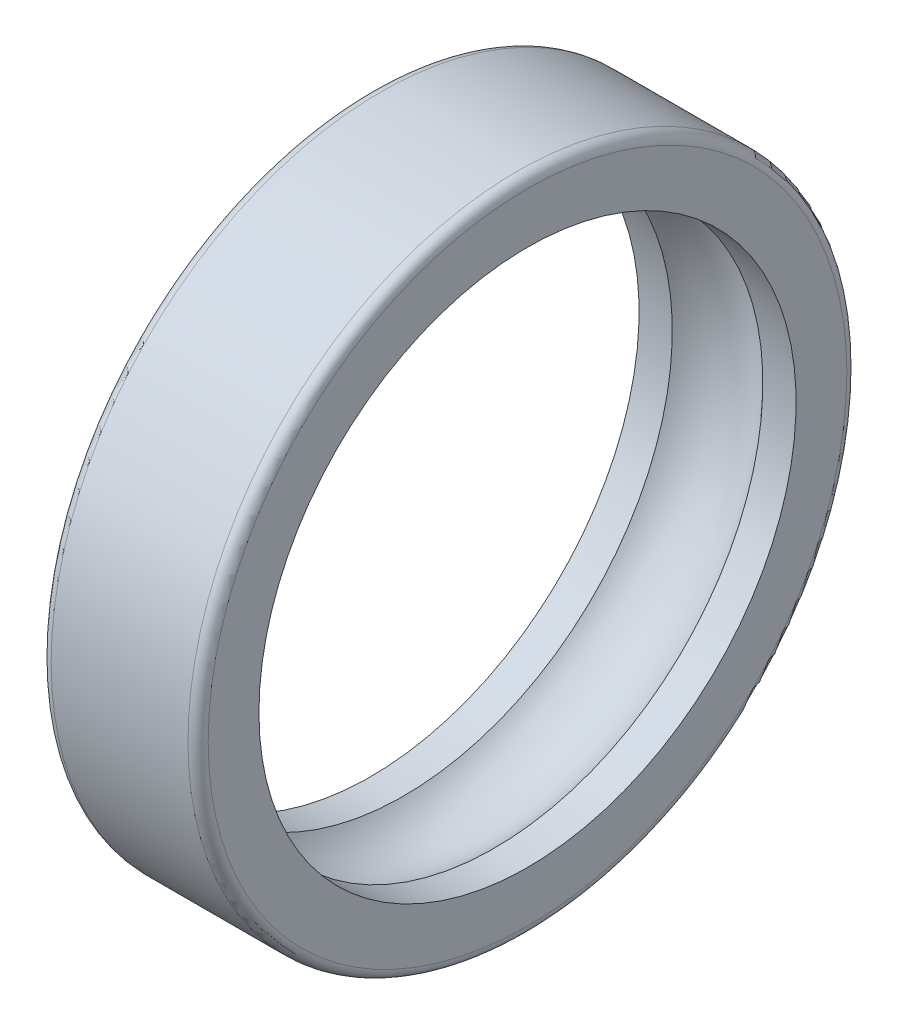
ISO-10303-21;
HEADER;
FILE_DESCRIPTION(('STEP AP214'),'2;1');
FILE_NAME('part.step','',(''),(''),'','','');
FILE_SCHEMA(('AUTOMOTIVE_DESIGN { 1 0 10303 214 1 1 1 1 }'));
ENDSEC;
DATA;
#1=APPLICATION_CONTEXT('core data for automotive mechanical design processes');
#2=APPLICATION_PROTOCOL_DEFINITION('international standard','automotive_design',2000,#1);
#3=PRODUCT_CONTEXT('',#1,'mechanical');
#4=PRODUCT('Part','Part','',(#3));
#5=PRODUCT_RELATED_PRODUCT_CATEGORY('part','',(#4));
#6=PRODUCT_DEFINITION_FORMATION('','',#4);
#7=PRODUCT_DEFINITION_CONTEXT('part definition',#1,'design');
#8=PRODUCT_DEFINITION('design','',#6,#7);
#9=PRODUCT_DEFINITION_SHAPE('','',#8);
#10=(LENGTH_UNIT() NAMED_UNIT(*) SI_UNIT(.MILLI.,.METRE.));
#11=(NAMED_UNIT(*) PLANE_ANGLE_UNIT() SI_UNIT($,.RADIAN.));
#12=(NAMED_UNIT(*) SI_UNIT($,.STERADIAN.) SOLID_ANGLE_UNIT());
#13=UNCERTAINTY_MEASURE_WITH_UNIT(LENGTH_MEASURE(1.E-05),#10,'distance_accuracy_value','');
#14=(GEOMETRIC_REPRESENTATION_CONTEXT(3) GLOBAL_UNCERTAINTY_ASSIGNED_CONTEXT((#13)) GLOBAL_UNIT_ASSIGNED_CONTEXT((#10,
#11,#12)) REPRESENTATION_CONTEXT('',''));
#15=CARTESIAN_POINT('',(0.,0.,0.));
#16=DIRECTION('',(0.,0.,1.));
#17=DIRECTION('',(1.,0.,0.));
#18=AXIS2_PLACEMENT_3D('',#15,#16,#17);
#19=CARTESIAN_POINT('',(3.575,15.,0.));
#20=DIRECTION('',(-1.,0.,0.));
#21=DIRECTION('',(0.,0.,1.));
#22=AXIS2_PLACEMENT_3D('',#19,#20,#21);
#23=PLANE('',#22);
#24=CARTESIAN_POINT('',(3.575,0.,0.));
#25=DIRECTION('',(-1.,0.,0.));
#26=DIRECTION('',(0.,0.,1.));
#27=AXIS2_PLACEMENT_3D('',#24,#25,#26);
#28=CIRCLE('',#27,14.54);
#29=CARTESIAN_POINT('',(3.575,0.,14.54));
#30=VERTEX_POINT('',#29);
#31=EDGE_CURVE('E38',#30,#30,#28,.F.);
#32=ORIENTED_EDGE('',*,*,#31,.T.);
#33=EDGE_LOOP('',(#32));
#34=FACE_BOUND('',#33,.T.);
#35=CARTESIAN_POINT('',(3.575,0.,0.));
#36=DIRECTION('',(-1.,0.,0.));
#37=DIRECTION('',(0.,0.,1.));
#38=AXIS2_PLACEMENT_3D('',#35,#36,#37);
#39=CIRCLE('',#38,12.23);
#40=CARTESIAN_POINT('',(3.575,0.,12.23));
#41=VERTEX_POINT('',#40);
#42=EDGE_CURVE('E51',#41,#41,#39,.T.);
#43=ORIENTED_EDGE('',*,*,#42,.T.);
#44=EDGE_LOOP('',(#43));
#45=FACE_BOUND('',#44,.T.);
#46=ADVANCED_FACE('F31',(#34,#45),#23,.F.);
#47=CARTESIAN_POINT('',(0.,0.,0.));
#48=DIRECTION('',(-1.,0.,0.));
#49=DIRECTION('',(0.,0.,1.));
#50=AXIS2_PLACEMENT_3D('',#47,#48,#49);
#51=CYLINDRICAL_SURFACE('',#50,12.23);
#52=ORIENTED_EDGE('',*,*,#42,.F.);
#53=EDGE_LOOP('',(#52));
#54=FACE_BOUND('',#53,.T.);
#55=CARTESIAN_POINT('',(2.06164982477627,0.,0.));
#56=DIRECTION('',(-1.,0.,0.));
#57=DIRECTION('',(0.,0.,1.));
#58=AXIS2_PLACEMENT_3D('',#55,#56,#57);
#59=CIRCLE('',#58,12.23);
#60=CARTESIAN_POINT('',(2.06164982477627,0.,12.23));
#61=VERTEX_POINT('',#60);
#62=EDGE_CURVE('E54',#61,#61,#59,.T.);
#63=ORIENTED_EDGE('',*,*,#62,.T.);
#64=EDGE_LOOP('',(#63));
#65=FACE_BOUND('',#64,.T.);
#66=ADVANCED_FACE('F81',(#54,#65),#51,.F.);
#67=CARTESIAN_POINT('',(0.,0.,0.));
#68=DIRECTION('',(-1.,0.,0.));
#69=DIRECTION('',(0.,0.,1.));
#70=AXIS2_PLACEMENT_3D('',#67,#68,#69);
#71=TOROIDAL_SURFACE('',#70,10.38,2.77);
#72=ORIENTED_EDGE('',*,*,#62,.F.);
#73=EDGE_LOOP('',(#72));
#74=FACE_BOUND('',#73,.T.);
#75=CARTESIAN_POINT('',(-2.06164982477627,0.,0.));
#76=DIRECTION('',(-1.,0.,0.));
#77=DIRECTION('',(0.,0.,1.));
#78=AXIS2_PLACEMENT_3D('',#75,#76,#77);
#79=CIRCLE('',#78,12.23);
#80=CARTESIAN_POINT('',(-2.06164982477627,0.,12.23));
#81=VERTEX_POINT('',#80);
#82=EDGE_CURVE('E57',#81,#81,#79,.T.);
#83=ORIENTED_EDGE('',*,*,#82,.T.);
#84=EDGE_LOOP('',(#83));
#85=FACE_BOUND('',#84,.T.);
#86=ADVANCED_FACE('F77',(#74,#85),#71,.F.);
#87=CARTESIAN_POINT('',(0.,0.,0.));
#88=DIRECTION('',(-1.,0.,0.));
#89=DIRECTION('',(0.,0.,1.));
#90=AXIS2_PLACEMENT_3D('',#87,#88,#89);
#91=CYLINDRICAL_SURFACE('',#90,12.23);
#92=ORIENTED_EDGE('',*,*,#82,.F.);
#93=EDGE_LOOP('',(#92));
#94=FACE_BOUND('',#93,.T.);
#95=CARTESIAN_POINT('',(-3.575,0.,0.));
#96=DIRECTION('',(-1.,0.,0.));
#97=DIRECTION('',(0.,0.,1.));
#98=AXIS2_PLACEMENT_3D('',#95,#96,#97);
#99=CIRCLE('',#98,12.23);
#100=CARTESIAN_POINT('',(-3.575,0.,12.23));
#101=VERTEX_POINT('',#100);
#102=EDGE_CURVE('E60',#101,#101,#99,.T.);
#103=ORIENTED_EDGE('',*,*,#102,.T.);
#104=EDGE_LOOP('',(#103));
#105=FACE_BOUND('',#104,.T.);
#106=ADVANCED_FACE('F64',(#94,#105),#91,.F.);
#107=CARTESIAN_POINT('',(-3.575,15.,0.));
#108=DIRECTION('',(1.,0.,0.));
#109=DIRECTION('',(0.,0.,-1.));
#110=AXIS2_PLACEMENT_3D('',#107,#108,#109);
#111=PLANE('',#110);
#112=CARTESIAN_POINT('',(-3.575,0.,0.));
#113=DIRECTION('',(1.,0.,0.));
#114=DIRECTION('',(0.,0.,-1.));
#115=AXIS2_PLACEMENT_3D('',#112,#113,#114);
#116=CIRCLE('',#115,14.54);
#117=CARTESIAN_POINT('',(-3.575,0.,-14.54));
#118=VERTEX_POINT('',#117);
#119=EDGE_CURVE('E10',#118,#118,#116,.F.);
#120=ORIENTED_EDGE('',*,*,#119,.T.);
#121=EDGE_LOOP('',(#120));
#122=FACE_BOUND('',#121,.T.);
#123=ORIENTED_EDGE('',*,*,#102,.F.);
#124=EDGE_LOOP('',(#123));
#125=FACE_BOUND('',#124,.T.);
#126=ADVANCED_FACE('F66',(#122,#125),#111,.F.);
#127=CARTESIAN_POINT('',(0.,0.,0.));
#128=DIRECTION('',(-1.,0.,0.));
#129=DIRECTION('',(0.,0.,1.));
#130=AXIS2_PLACEMENT_3D('',#127,#128,#129);
#131=CYLINDRICAL_SURFACE('',#130,15.);
#132=CARTESIAN_POINT('',(3.115,0.,0.));
#133=DIRECTION('',(-1.,0.,0.));
#134=DIRECTION('',(0.,0.,1.));
#135=AXIS2_PLACEMENT_3D('',#132,#133,#134);
#136=CIRCLE('',#135,15.);
#137=CARTESIAN_POINT('',(3.115,0.,15.));
#138=VERTEX_POINT('',#137);
#139=EDGE_CURVE('E42',#138,#138,#136,.T.);
#140=ORIENTED_EDGE('',*,*,#139,.T.);
#141=EDGE_LOOP('',(#140));
#142=FACE_BOUND('',#141,.T.);
#143=CARTESIAN_POINT('',(-3.115,0.,0.));
#144=DIRECTION('',(1.,0.,0.));
#145=DIRECTION('',(0.,0.,-1.));
#146=AXIS2_PLACEMENT_3D('',#143,#144,#145);
#147=CIRCLE('',#146,15.);
#148=CARTESIAN_POINT('',(-3.115,0.,-15.));
#149=VERTEX_POINT('',#148);
#150=EDGE_CURVE('E46',#149,#149,#147,.T.);
#151=ORIENTED_EDGE('',*,*,#150,.T.);
#152=EDGE_LOOP('',(#151));
#153=FACE_BOUND('',#152,.T.);
#154=ADVANCED_FACE('F68',(#142,#153),#131,.T.);
#155=CARTESIAN_POINT('',(3.115,0.,0.));
#156=DIRECTION('',(-1.,0.,0.));
#157=DIRECTION('',(0.,0.,1.));
#158=AXIS2_PLACEMENT_3D('',#155,#156,#157);
#159=TOROIDAL_SURFACE('',#158,14.54,0.46);
#160=ORIENTED_EDGE('',*,*,#31,.F.);
#161=EDGE_LOOP('',(#160));
#162=FACE_BOUND('',#161,.T.);
#163=ORIENTED_EDGE('',*,*,#139,.F.);
#164=EDGE_LOOP('',(#163));
#165=FACE_BOUND('',#164,.T.);
#166=ADVANCED_FACE('F74',(#162,#165),#159,.T.);
#167=CARTESIAN_POINT('',(-3.115,0.,0.));
#168=DIRECTION('',(1.,0.,0.));
#169=DIRECTION('',(0.,0.,-1.));
#170=AXIS2_PLACEMENT_3D('',#167,#168,#169);
#171=TOROIDAL_SURFACE('',#170,14.54,0.46);
#172=ORIENTED_EDGE('',*,*,#150,.F.);
#173=EDGE_LOOP('',(#172));
#174=FACE_BOUND('',#173,.T.);
#175=ORIENTED_EDGE('',*,*,#119,.F.);
#176=EDGE_LOOP('',(#175));
#177=FACE_BOUND('',#176,.T.);
#178=ADVANCED_FACE('F33',(#174,#177),#171,.T.);
#179=CLOSED_SHELL('',(#46,#66,#86,#106,#126,#154,#166,#178));
#180=MANIFOLD_SOLID_BREP('B2',#179);
#181=ADVANCED_BREP_SHAPE_REPRESENTATION('',(#18,#180),#14);
#182=SHAPE_DEFINITION_REPRESENTATION(#9,#181);
ENDSEC;
END-ISO-10303-21;
